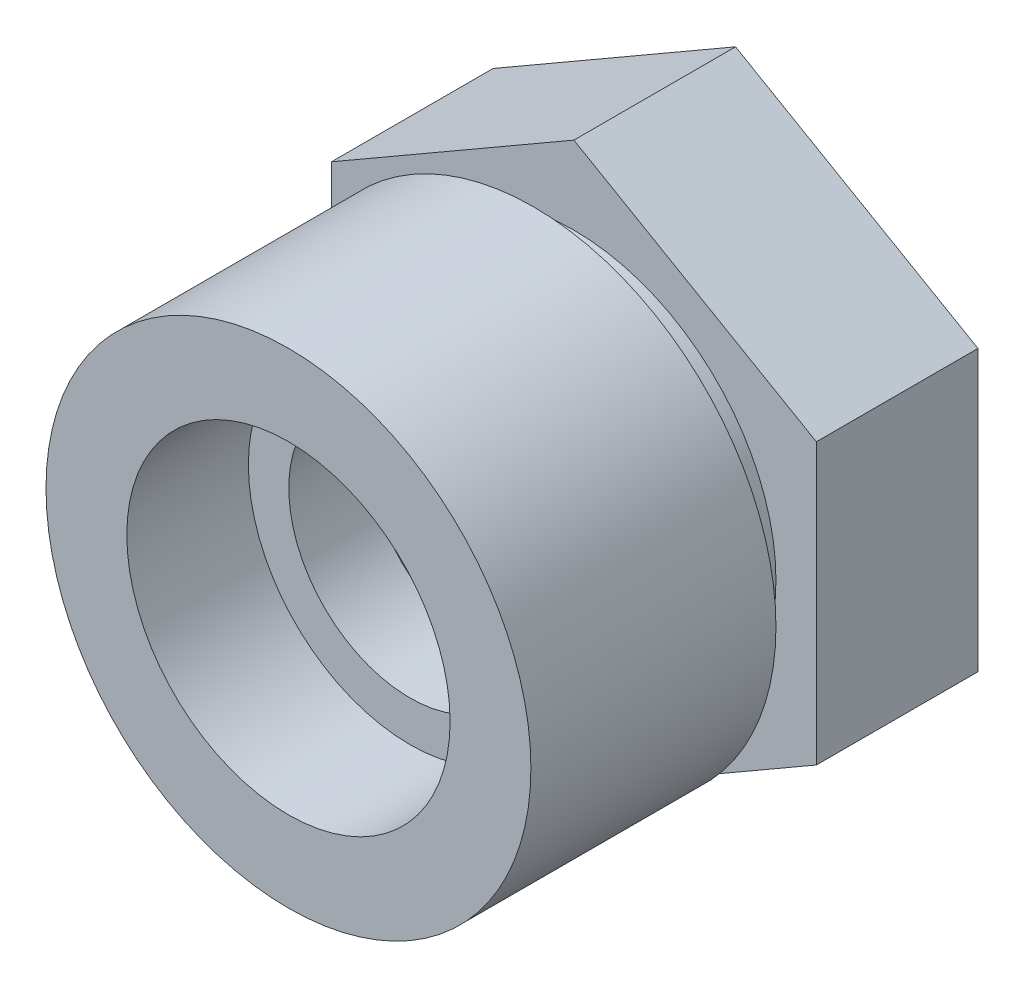
ISO-10303-21;
HEADER;
FILE_DESCRIPTION(('STEP AP214'),'2;1');
FILE_NAME('part.step','',(''),(''),'','','');
FILE_SCHEMA(('AUTOMOTIVE_DESIGN { 1 0 10303 214 1 1 1 1 }'));
ENDSEC;
DATA;
#1=APPLICATION_CONTEXT('core data for automotive mechanical design processes');
#2=APPLICATION_PROTOCOL_DEFINITION('international standard','automotive_design',2000,#1);
#3=PRODUCT_CONTEXT('',#1,'mechanical');
#4=PRODUCT('Part','Part','',(#3));
#5=PRODUCT_RELATED_PRODUCT_CATEGORY('part','',(#4));
#6=PRODUCT_DEFINITION_FORMATION('','',#4);
#7=PRODUCT_DEFINITION_CONTEXT('part definition',#1,'design');
#8=PRODUCT_DEFINITION('design','',#6,#7);
#9=PRODUCT_DEFINITION_SHAPE('','',#8);
#10=(LENGTH_UNIT() NAMED_UNIT(*) SI_UNIT(.MILLI.,.METRE.));
#11=(NAMED_UNIT(*) PLANE_ANGLE_UNIT() SI_UNIT($,.RADIAN.));
#12=(NAMED_UNIT(*) SI_UNIT($,.STERADIAN.) SOLID_ANGLE_UNIT());
#13=UNCERTAINTY_MEASURE_WITH_UNIT(LENGTH_MEASURE(1.E-05),#10,'distance_accuracy_value','');
#14=(GEOMETRIC_REPRESENTATION_CONTEXT(3) GLOBAL_UNCERTAINTY_ASSIGNED_CONTEXT((#13)) GLOBAL_UNIT_ASSIGNED_CONTEXT((#10,
#11,#12)) REPRESENTATION_CONTEXT('',''));
#15=CARTESIAN_POINT('',(0.,0.,0.));
#16=DIRECTION('',(0.,0.,1.));
#17=DIRECTION('',(1.,0.,0.));
#18=AXIS2_PLACEMENT_3D('',#15,#16,#17);
#19=CARTESIAN_POINT('',(0.,0.,-6.35));
#20=DIRECTION('',(0.,0.,-1.));
#21=DIRECTION('',(-1.,0.,0.));
#22=AXIS2_PLACEMENT_3D('',#19,#20,#21);
#23=CYLINDRICAL_SURFACE('',#22,2.01929999999999);
#24=CARTESIAN_POINT('',(0.,0.,1.5875));
#25=DIRECTION('',(0.,0.,1.));
#26=DIRECTION('',(1.,0.,0.));
#27=AXIS2_PLACEMENT_3D('',#24,#25,#26);
#28=CIRCLE('',#27,2.01929999999999);
#29=CARTESIAN_POINT('',(2.01929999999999,0.,1.5875));
#30=VERTEX_POINT('',#29);
#31=EDGE_CURVE('E68',#30,#30,#28,.T.);
#32=ORIENTED_EDGE('',*,*,#31,.F.);
#33=EDGE_LOOP('',(#32));
#34=FACE_BOUND('',#33,.T.);
#35=CARTESIAN_POINT('',(0.,0.,3.3909));
#36=DIRECTION('',(0.,0.,1.));
#37=DIRECTION('',(1.,0.,0.));
#38=AXIS2_PLACEMENT_3D('',#35,#36,#37);
#39=CIRCLE('',#38,2.01929999999999);
#40=CARTESIAN_POINT('',(2.01929999999999,0.,3.3909));
#41=VERTEX_POINT('',#40);
#42=EDGE_CURVE('E59',#41,#41,#39,.F.);
#43=ORIENTED_EDGE('',*,*,#42,.F.);
#44=EDGE_LOOP('',(#43));
#45=FACE_BOUND('',#44,.T.);
#46=ADVANCED_FACE('F55',(#34,#45),#23,.F.);
#47=CARTESIAN_POINT('',(0.,0.,11.2141));
#48=DIRECTION('',(0.,0.,-1.));
#49=DIRECTION('',(-1.,0.,0.));
#50=AXIS2_PLACEMENT_3D('',#47,#48,#49);
#51=CYLINDRICAL_SURFACE('',#50,9.525);
#52=CARTESIAN_POINT('',(0.,0.,11.2141));
#53=DIRECTION('',(0.,0.,1.));
#54=DIRECTION('',(1.,0.,0.));
#55=AXIS2_PLACEMENT_3D('',#52,#53,#54);
#56=CIRCLE('',#55,9.525);
#57=CARTESIAN_POINT('',(9.525,0.,11.2141));
#58=VERTEX_POINT('',#57);
#59=EDGE_CURVE('E13',#58,#58,#56,.T.);
#60=ORIENTED_EDGE('',*,*,#59,.F.);
#61=EDGE_LOOP('',(#60));
#62=FACE_BOUND('',#61,.T.);
#63=CARTESIAN_POINT('',(0.,0.,1.5875));
#64=DIRECTION('',(0.,0.,1.));
#65=DIRECTION('',(1.,0.,0.));
#66=AXIS2_PLACEMENT_3D('',#63,#64,#65);
#67=CIRCLE('',#66,9.525);
#68=CARTESIAN_POINT('',(9.525,0.,1.5875));
#69=VERTEX_POINT('',#68);
#70=EDGE_CURVE('E63',#69,#69,#67,.T.);
#71=ORIENTED_EDGE('',*,*,#70,.T.);
#72=EDGE_LOOP('',(#71));
#73=FACE_BOUND('',#72,.T.);
#74=ADVANCED_FACE('F57',(#62,#73),#51,.T.);
#75=CARTESIAN_POINT('',(0.,0.,11.2141));
#76=DIRECTION('',(0.,0.,1.));
#77=DIRECTION('',(1.,0.,0.));
#78=AXIS2_PLACEMENT_3D('',#75,#76,#77);
#79=PLANE('',#78);
#80=CARTESIAN_POINT('',(0.,0.,11.2141));
#81=DIRECTION('',(0.,0.,1.));
#82=DIRECTION('',(1.,0.,0.));
#83=AXIS2_PLACEMENT_3D('',#80,#81,#82);
#84=CIRCLE('',#83,6.35);
#85=CARTESIAN_POINT('',(6.35,0.,11.2141));
#86=VERTEX_POINT('',#85);
#87=EDGE_CURVE('E71',#86,#86,#84,.T.);
#88=ORIENTED_EDGE('',*,*,#87,.F.);
#89=EDGE_LOOP('',(#88));
#90=FACE_BOUND('',#89,.T.);
#91=ORIENTED_EDGE('',*,*,#59,.T.);
#92=EDGE_LOOP('',(#91));
#93=FACE_BOUND('',#92,.T.);
#94=ADVANCED_FACE('F100',(#90,#93),#79,.T.);
#95=CARTESIAN_POINT('',(0.,0.,1.5875));
#96=DIRECTION('',(0.,0.,1.));
#97=DIRECTION('',(1.,0.,0.));
#98=AXIS2_PLACEMENT_3D('',#95,#96,#97);
#99=PLANE('',#98);
#100=ORIENTED_EDGE('',*,*,#31,.T.);
#101=EDGE_LOOP('',(#100));
#102=FACE_BOUND('',#101,.T.);
#103=ORIENTED_EDGE('',*,*,#70,.F.);
#104=EDGE_LOOP('',(#103));
#105=FACE_BOUND('',#104,.T.);
#106=ADVANCED_FACE('F107',(#102,#105),#99,.F.);
#107=CARTESIAN_POINT('',(0.,0.,6.4389));
#108=DIRECTION('',(0.,0.,1.));
#109=DIRECTION('',(1.,0.,0.));
#110=AXIS2_PLACEMENT_3D('',#107,#108,#109);
#111=PLANE('',#110);
#112=CARTESIAN_POINT('',(0.,0.,6.4389));
#113=DIRECTION('',(0.,0.,1.));
#114=DIRECTION('',(1.,0.,0.));
#115=AXIS2_PLACEMENT_3D('',#112,#113,#114);
#116=CIRCLE('',#115,4.7625);
#117=CARTESIAN_POINT('',(4.7625,0.,6.4389));
#118=VERTEX_POINT('',#117);
#119=EDGE_CURVE('E82',#118,#118,#116,.T.);
#120=ORIENTED_EDGE('',*,*,#119,.F.);
#121=EDGE_LOOP('',(#120));
#122=FACE_BOUND('',#121,.T.);
#123=CARTESIAN_POINT('',(0.,0.,6.4389));
#124=DIRECTION('',(0.,0.,1.));
#125=DIRECTION('',(1.,0.,0.));
#126=AXIS2_PLACEMENT_3D('',#123,#124,#125);
#127=CIRCLE('',#126,6.35);
#128=CARTESIAN_POINT('',(6.35,0.,6.4389));
#129=VERTEX_POINT('',#128);
#130=EDGE_CURVE('E74',#129,#129,#127,.T.);
#131=ORIENTED_EDGE('',*,*,#130,.T.);
#132=EDGE_LOOP('',(#131));
#133=FACE_BOUND('',#132,.T.);
#134=ADVANCED_FACE('F110',(#122,#133),#111,.T.);
#135=CARTESIAN_POINT('',(0.,0.,6.4389));
#136=DIRECTION('',(0.,0.,1.));
#137=DIRECTION('',(1.,0.,0.));
#138=AXIS2_PLACEMENT_3D('',#135,#136,#137);
#139=CYLINDRICAL_SURFACE('',#138,6.35);
#140=ORIENTED_EDGE('',*,*,#130,.F.);
#141=EDGE_LOOP('',(#140));
#142=FACE_BOUND('',#141,.T.);
#143=ORIENTED_EDGE('',*,*,#87,.T.);
#144=EDGE_LOOP('',(#143));
#145=FACE_BOUND('',#144,.T.);
#146=ADVANCED_FACE('F104',(#142,#145),#139,.F.);
#147=CARTESIAN_POINT('',(0.,0.,3.3909));
#148=DIRECTION('',(0.,0.,1.));
#149=DIRECTION('',(1.,0.,0.));
#150=AXIS2_PLACEMENT_3D('',#147,#148,#149);
#151=PLANE('',#150);
#152=CARTESIAN_POINT('',(0.,0.,3.3909));
#153=DIRECTION('',(0.,0.,1.));
#154=DIRECTION('',(1.,0.,0.));
#155=AXIS2_PLACEMENT_3D('',#152,#153,#154);
#156=CIRCLE('',#155,4.7625);
#157=CARTESIAN_POINT('',(4.7625,0.,3.3909));
#158=VERTEX_POINT('',#157);
#159=EDGE_CURVE('E85',#158,#158,#156,.T.);
#160=ORIENTED_EDGE('',*,*,#159,.T.);
#161=EDGE_LOOP('',(#160));
#162=FACE_BOUND('',#161,.T.);
#163=ORIENTED_EDGE('',*,*,#42,.T.);
#164=EDGE_LOOP('',(#163));
#165=FACE_BOUND('',#164,.T.);
#166=ADVANCED_FACE('F92',(#162,#165),#151,.T.);
#167=CARTESIAN_POINT('',(0.,0.,3.3909));
#168=DIRECTION('',(0.,0.,1.));
#169=DIRECTION('',(1.,0.,0.));
#170=AXIS2_PLACEMENT_3D('',#167,#168,#169);
#171=CYLINDRICAL_SURFACE('',#170,4.7625);
#172=CARTESIAN_POINT('',(4.7625,0.,3.3909));
#173=CARTESIAN_POINT('',(4.7625,0.,3.42265));
#174=CARTESIAN_POINT('',(4.7625,0.,3.4544));
#175=CARTESIAN_POINT('',(4.7625,0.,3.5179));
#176=CARTESIAN_POINT('',(4.7625,0.,3.54965));
#177=CARTESIAN_POINT('',(4.7625,0.,3.61315));
#178=CARTESIAN_POINT('',(4.7625,0.,3.6449));
#179=CARTESIAN_POINT('',(4.7625,0.,3.7084));
#180=CARTESIAN_POINT('',(4.7625,0.,3.74015));
#181=CARTESIAN_POINT('',(4.7625,0.,3.80365));
#182=CARTESIAN_POINT('',(4.7625,0.,3.8354));
#183=CARTESIAN_POINT('',(4.7625,0.,3.8989));
#184=CARTESIAN_POINT('',(4.7625,0.,3.93065));
#185=CARTESIAN_POINT('',(4.7625,0.,3.99415));
#186=CARTESIAN_POINT('',(4.7625,0.,4.0259));
#187=CARTESIAN_POINT('',(4.7625,0.,4.0894));
#188=CARTESIAN_POINT('',(4.7625,0.,4.12115));
#189=CARTESIAN_POINT('',(4.7625,0.,4.18465));
#190=CARTESIAN_POINT('',(4.7625,0.,4.2164));
#191=CARTESIAN_POINT('',(4.7625,0.,4.2799));
#192=CARTESIAN_POINT('',(4.7625,0.,4.31165));
#193=CARTESIAN_POINT('',(4.7625,0.,4.37515));
#194=CARTESIAN_POINT('',(4.7625,0.,4.4069));
#195=CARTESIAN_POINT('',(4.7625,0.,4.4704));
#196=CARTESIAN_POINT('',(4.7625,0.,4.50215));
#197=CARTESIAN_POINT('',(4.7625,0.,4.56565));
#198=CARTESIAN_POINT('',(4.7625,0.,4.5974));
#199=CARTESIAN_POINT('',(4.7625,0.,4.6609));
#200=CARTESIAN_POINT('',(4.7625,0.,4.69265));
#201=CARTESIAN_POINT('',(4.7625,0.,4.75615));
#202=CARTESIAN_POINT('',(4.7625,0.,4.7879));
#203=CARTESIAN_POINT('',(4.7625,0.,4.8514));
#204=CARTESIAN_POINT('',(4.7625,0.,4.88315));
#205=CARTESIAN_POINT('',(4.7625,0.,4.94665));
#206=CARTESIAN_POINT('',(4.7625,0.,4.9784));
#207=CARTESIAN_POINT('',(4.7625,0.,5.0419));
#208=CARTESIAN_POINT('',(4.7625,0.,5.07365));
#209=CARTESIAN_POINT('',(4.7625,0.,5.13715));
#210=CARTESIAN_POINT('',(4.7625,0.,5.1689));
#211=CARTESIAN_POINT('',(4.7625,0.,5.2324));
#212=CARTESIAN_POINT('',(4.7625,0.,5.26415));
#213=CARTESIAN_POINT('',(4.7625,0.,5.32765));
#214=CARTESIAN_POINT('',(4.7625,0.,5.3594));
#215=CARTESIAN_POINT('',(4.7625,0.,5.4229));
#216=CARTESIAN_POINT('',(4.7625,0.,5.45465));
#217=CARTESIAN_POINT('',(4.7625,0.,5.51815));
#218=CARTESIAN_POINT('',(4.7625,0.,5.5499));
#219=CARTESIAN_POINT('',(4.7625,0.,5.6134));
#220=CARTESIAN_POINT('',(4.7625,0.,5.64515));
#221=CARTESIAN_POINT('',(4.7625,0.,5.70865));
#222=CARTESIAN_POINT('',(4.7625,0.,5.7404));
#223=CARTESIAN_POINT('',(4.7625,0.,5.8039));
#224=CARTESIAN_POINT('',(4.7625,0.,5.83565));
#225=CARTESIAN_POINT('',(4.7625,0.,5.89915));
#226=CARTESIAN_POINT('',(4.7625,0.,5.9309));
#227=CARTESIAN_POINT('',(4.7625,0.,5.9944));
#228=CARTESIAN_POINT('',(4.7625,0.,6.02615));
#229=CARTESIAN_POINT('',(4.7625,0.,6.08965));
#230=CARTESIAN_POINT('',(4.7625,0.,6.1214));
#231=CARTESIAN_POINT('',(4.7625,0.,6.1849));
#232=CARTESIAN_POINT('',(4.7625,0.,6.21665));
#233=CARTESIAN_POINT('',(4.7625,0.,6.28015));
#234=CARTESIAN_POINT('',(4.7625,0.,6.3119));
#235=CARTESIAN_POINT('',(4.7625,0.,6.3754));
#236=CARTESIAN_POINT('',(4.7625,0.,6.40715));
#237=CARTESIAN_POINT('',(4.7625,0.,6.4389));
#238=B_SPLINE_CURVE_WITH_KNOTS('',3,(#172,#173,#174,#175,#176,#177,#178,#179,#180,#181,#182,
#183,#184,#185,#186,#187,#188,#189,#190,#191,#192,#193,#194,#195,#196,#197,#198,#199,#200,#201,
#202,#203,#204,#205,#206,#207,#208,#209,#210,#211,#212,#213,#214,#215,#216,#217,#218,#219,#220,
#221,#222,#223,#224,#225,#226,#227,#228,#229,#230,#231,#232,#233,#234,#235,#236,#237),
.UNSPECIFIED.,.F.,.F.,(4,2,2,2,2,2,2,2,2,2,2,2,2,2,2,2,2,2,2,2,2,2,2,2,2,2,2,2,2,2,2,2,4),(0.,
0.0952500000000003,0.1905,0.28575,0.381,0.47625,0.5715,0.66675,0.762000000000001,0.85725,0.9525,
1.04775,1.143,1.23825,1.3335,1.42875,1.524,1.61925,1.7145,1.80975,1.905,2.00025,2.0955,2.19075,
2.286,2.38125,2.4765,2.57175,2.667,2.76225,2.8575,2.95275,3.048),.UNSPECIFIED.);
#239=EDGE_CURVE('BSEAM124',#158,#118,#238,.T.);
#240=ORIENTED_EDGE('',*,*,#159,.F.);
#241=ORIENTED_EDGE('',*,*,#119,.T.);
#242=ORIENTED_EDGE('',*,*,#239,.T.);
#243=ORIENTED_EDGE('',*,*,#239,.F.);
#244=EDGE_LOOP('',(#240,#242,#241,#243));
#245=FACE_BOUND('',#244,.T.);
#246=ADVANCED_FACE('F124',(#245),#171,.F.);
#247=CLOSED_SHELL('',(#46,#74,#94,#106,#134,#146,#166,#246));
#248=MANIFOLD_SOLID_BREP('B2',#247);
#249=CARTESIAN_POINT('',(0.,0.,1.5875));
#250=DIRECTION('',(0.,0.,-1.));
#251=DIRECTION('',(-1.,0.,0.));
#252=AXIS2_PLACEMENT_3D('',#249,#250,#251);
#253=CYLINDRICAL_SURFACE('',#252,7.9375);
#254=CARTESIAN_POINT('',(0.,0.,1.5875));
#255=DIRECTION('',(0.,0.,1.));
#256=DIRECTION('',(1.,0.,0.));
#257=AXIS2_PLACEMENT_3D('',#254,#255,#256);
#258=CIRCLE('',#257,7.9375);
#259=CARTESIAN_POINT('',(7.9375,0.,1.5875));
#260=VERTEX_POINT('',#259);
#261=EDGE_CURVE('E54',#260,#260,#258,.T.);
#262=ORIENTED_EDGE('',*,*,#261,.F.);
#263=EDGE_LOOP('',(#262));
#264=FACE_BOUND('',#263,.T.);
#265=CARTESIAN_POINT('',(0.,0.,0.));
#266=DIRECTION('',(0.,0.,1.));
#267=DIRECTION('',(1.,0.,0.));
#268=AXIS2_PLACEMENT_3D('',#265,#266,#267);
#269=CIRCLE('',#268,7.9375);
#270=CARTESIAN_POINT('',(7.9375,0.,0.));
#271=VERTEX_POINT('',#270);
#272=EDGE_CURVE('E204',#271,#271,#269,.T.);
#273=ORIENTED_EDGE('',*,*,#272,.T.);
#274=EDGE_LOOP('',(#273));
#275=FACE_BOUND('',#274,.T.);
#276=ADVANCED_FACE('F197',(#264,#275),#253,.T.);
#277=CARTESIAN_POINT('',(0.,0.,1.5875));
#278=DIRECTION('',(0.,0.,1.));
#279=DIRECTION('',(1.,0.,0.));
#280=AXIS2_PLACEMENT_3D('',#277,#278,#279);
#281=PLANE('',#280);
#282=CARTESIAN_POINT('',(0.,0.,1.5875));
#283=DIRECTION('',(0.,0.,1.));
#284=DIRECTION('',(1.,0.,0.));
#285=AXIS2_PLACEMENT_3D('',#282,#283,#284);
#286=CIRCLE('',#285,2.01929999999999);
#287=CARTESIAN_POINT('',(2.01929999999999,0.,1.5875));
#288=VERTEX_POINT('',#287);
#289=EDGE_CURVE('E209',#288,#288,#286,.T.);
#290=ORIENTED_EDGE('',*,*,#289,.F.);
#291=EDGE_LOOP('',(#290));
#292=FACE_BOUND('',#291,.T.);
#293=ORIENTED_EDGE('',*,*,#261,.T.);
#294=EDGE_LOOP('',(#293));
#295=FACE_BOUND('',#294,.T.);
#296=ADVANCED_FACE('F226',(#292,#295),#281,.T.);
#297=CARTESIAN_POINT('',(0.,0.,0.));
#298=DIRECTION('',(0.,0.,1.));
#299=DIRECTION('',(1.,0.,0.));
#300=AXIS2_PLACEMENT_3D('',#297,#298,#299);
#301=PLANE('',#300);
#302=CARTESIAN_POINT('',(0.,0.,0.));
#303=DIRECTION('',(0.,0.,1.));
#304=DIRECTION('',(1.,0.,0.));
#305=AXIS2_PLACEMENT_3D('',#302,#303,#304);
#306=CIRCLE('',#305,2.01929999999999);
#307=CARTESIAN_POINT('',(2.01929999999999,0.,0.));
#308=VERTEX_POINT('',#307);
#309=EDGE_CURVE('E200',#308,#308,#306,.T.);
#310=ORIENTED_EDGE('',*,*,#309,.T.);
#311=EDGE_LOOP('',(#310));
#312=FACE_BOUND('',#311,.T.);
#313=ORIENTED_EDGE('',*,*,#272,.F.);
#314=EDGE_LOOP('',(#313));
#315=FACE_BOUND('',#314,.T.);
#316=ADVANCED_FACE('F217',(#312,#315),#301,.F.);
#317=CARTESIAN_POINT('',(0.,0.,-6.35));
#318=DIRECTION('',(0.,0.,-1.));
#319=DIRECTION('',(-1.,0.,0.));
#320=AXIS2_PLACEMENT_3D('',#317,#318,#319);
#321=CYLINDRICAL_SURFACE('',#320,2.01929999999999);
#322=ORIENTED_EDGE('',*,*,#289,.T.);
#323=EDGE_LOOP('',(#322));
#324=FACE_BOUND('',#323,.T.);
#325=ORIENTED_EDGE('',*,*,#309,.F.);
#326=EDGE_LOOP('',(#325));
#327=FACE_BOUND('',#326,.T.);
#328=ADVANCED_FACE('F220',(#324,#327),#321,.F.);
#329=CLOSED_SHELL('',(#276,#296,#316,#328));
#330=MANIFOLD_SOLID_BREP('B8',#329);
#331=CARTESIAN_POINT('',(-9.52499999999994,-5.4992613140313,-6.35));
#332=DIRECTION('',(-0.499999999999995,-0.866025403784441,0.));
#333=DIRECTION('',(0.866025403784442,-0.499999999999995,0.));
#334=AXIS2_PLACEMENT_3D('',#331,#332,#333);
#335=PLANE('',#334);
#336=DIRECTION('',(0.866025403784441,-0.499999999999995,0.));
#337=VECTOR('',#336,1.);
#338=CARTESIAN_POINT('',(-9.52499999999994,-5.4992613140313,0.));
#339=LINE('',#338,#337);
#340=CARTESIAN_POINT('',(-9.52499999999994,-5.4992613140313,0.));
#341=VERTEX_POINT('',#340);
#342=CARTESIAN_POINT('',(0.,-10.9985226280624,0.));
#343=VERTEX_POINT('',#342);
#344=EDGE_CURVE('E353',#341,#343,#339,.T.);
#345=ORIENTED_EDGE('',*,*,#344,.F.);
#346=DIRECTION('',(0.,0.,1.));
#347=VECTOR('',#346,1.);
#348=CARTESIAN_POINT('',(-9.52499999999994,-5.4992613140313,-6.35));
#349=LINE('',#348,#347);
#350=CARTESIAN_POINT('',(-9.52499999999994,-5.4992613140313,-6.35));
#351=VERTEX_POINT('',#350);
#352=EDGE_CURVE('E195',#351,#341,#349,.T.);
#353=ORIENTED_EDGE('',*,*,#352,.F.);
#354=DIRECTION('',(0.866025403784441,-0.499999999999995,0.));
#355=VECTOR('',#354,1.);
#356=CARTESIAN_POINT('',(-9.52499999999994,-5.4992613140313,-6.35));
#357=LINE('',#356,#355);
#358=CARTESIAN_POINT('',(0.,-10.9985226280624,-6.35));
#359=VERTEX_POINT('',#358);
#360=EDGE_CURVE('E368',#351,#359,#357,.T.);
#361=ORIENTED_EDGE('',*,*,#360,.T.);
#362=DIRECTION('',(0.,0.,1.));
#363=VECTOR('',#362,1.);
#364=CARTESIAN_POINT('',(0.,-10.9985226280624,-6.35));
#365=LINE('',#364,#363);
#366=EDGE_CURVE('E271',#359,#343,#365,.T.);
#367=ORIENTED_EDGE('',*,*,#366,.T.);
#368=EDGE_LOOP('',(#345,#353,#361,#367));
#369=FACE_BOUND('',#368,.T.);
#370=ADVANCED_FACE('F268',(#369),#335,.T.);
#371=CARTESIAN_POINT('',(-9.52500000000006,5.4992613140311,-6.35));
#372=DIRECTION('',(-1.,0.,0.));
#373=DIRECTION('',(0.,-1.,0.));
#374=AXIS2_PLACEMENT_3D('',#371,#372,#373);
#375=PLANE('',#374);
#376=DIRECTION('',(0.,-1.,0.));
#377=VECTOR('',#376,1.);
#378=CARTESIAN_POINT('',(-9.52500000000006,5.4992613140311,0.));
#379=LINE('',#378,#377);
#380=CARTESIAN_POINT('',(-9.52500000000006,5.4992613140311,0.));
#381=VERTEX_POINT('',#380);
#382=EDGE_CURVE('E366',#381,#341,#379,.T.);
#383=ORIENTED_EDGE('',*,*,#382,.F.);
#384=DIRECTION('',(0.,0.,1.));
#385=VECTOR('',#384,1.);
#386=CARTESIAN_POINT('',(-9.52500000000006,5.4992613140311,-6.35));
#387=LINE('',#386,#385);
#388=CARTESIAN_POINT('',(-9.52500000000006,5.4992613140311,-6.35));
#389=VERTEX_POINT('',#388);
#390=EDGE_CURVE('E277',#389,#381,#387,.T.);
#391=ORIENTED_EDGE('',*,*,#390,.F.);
#392=DIRECTION('',(0.,-1.,0.));
#393=VECTOR('',#392,1.);
#394=CARTESIAN_POINT('',(-9.52500000000006,5.4992613140311,-6.35));
#395=LINE('',#394,#393);
#396=EDGE_CURVE('E343',#389,#351,#395,.T.);
#397=ORIENTED_EDGE('',*,*,#396,.T.);
#398=ORIENTED_EDGE('',*,*,#352,.T.);
#399=EDGE_LOOP('',(#383,#391,#397,#398));
#400=FACE_BOUND('',#399,.T.);
#401=ADVANCED_FACE('F376',(#400),#375,.T.);
#402=CARTESIAN_POINT('',(0.,10.9985226280624,-6.35));
#403=DIRECTION('',(-0.500000000000007,0.866025403784435,0.));
#404=DIRECTION('',(-0.866025403784435,-0.500000000000007,0.));
#405=AXIS2_PLACEMENT_3D('',#402,#403,#404);
#406=PLANE('',#405);
#407=DIRECTION('',(-0.866025403784435,-0.500000000000007,0.));
#408=VECTOR('',#407,1.);
#409=CARTESIAN_POINT('',(0.,10.9985226280624,0.));
#410=LINE('',#409,#408);
#411=CARTESIAN_POINT('',(0.,10.9985226280624,0.));
#412=VERTEX_POINT('',#411);
#413=EDGE_CURVE('E330',#412,#381,#410,.T.);
#414=ORIENTED_EDGE('',*,*,#413,.F.);
#415=DIRECTION('',(0.,0.,1.));
#416=VECTOR('',#415,1.);
#417=CARTESIAN_POINT('',(0.,10.9985226280624,-6.35));
#418=LINE('',#417,#416);
#419=CARTESIAN_POINT('',(0.,10.9985226280624,-6.35));
#420=VERTEX_POINT('',#419);
#421=EDGE_CURVE('E325',#420,#412,#418,.T.);
#422=ORIENTED_EDGE('',*,*,#421,.F.);
#423=DIRECTION('',(-0.866025403784435,-0.500000000000007,0.));
#424=VECTOR('',#423,1.);
#425=CARTESIAN_POINT('',(0.,10.9985226280624,-6.35));
#426=LINE('',#425,#424);
#427=EDGE_CURVE('E328',#420,#389,#426,.T.);
#428=ORIENTED_EDGE('',*,*,#427,.T.);
#429=ORIENTED_EDGE('',*,*,#390,.T.);
#430=EDGE_LOOP('',(#414,#422,#428,#429));
#431=FACE_BOUND('',#430,.T.);
#432=ADVANCED_FACE('F327',(#431),#406,.T.);
#433=CARTESIAN_POINT('',(9.52499999999998,5.49926131403123,-6.35));
#434=DIRECTION('',(0.499999999999995,0.866025403784441,0.));
#435=DIRECTION('',(-0.866025403784441,0.499999999999995,0.));
#436=AXIS2_PLACEMENT_3D('',#433,#434,#435);
#437=PLANE('',#436);
#438=DIRECTION('',(-0.866025403784441,0.499999999999995,0.));
#439=VECTOR('',#438,1.);
#440=CARTESIAN_POINT('',(9.52499999999998,5.49926131403123,0.));
#441=LINE('',#440,#439);
#442=CARTESIAN_POINT('',(9.52499999999998,5.49926131403123,0.));
#443=VERTEX_POINT('',#442);
#444=EDGE_CURVE('E363',#443,#412,#441,.T.);
#445=ORIENTED_EDGE('',*,*,#444,.F.);
#446=DIRECTION('',(0.,0.,1.));
#447=VECTOR('',#446,1.);
#448=CARTESIAN_POINT('',(9.52499999999998,5.49926131403123,-6.35));
#449=LINE('',#448,#447);
#450=CARTESIAN_POINT('',(9.52499999999998,5.49926131403123,-6.35));
#451=VERTEX_POINT('',#450);
#452=EDGE_CURVE('E335',#451,#443,#449,.T.);
#453=ORIENTED_EDGE('',*,*,#452,.F.);
#454=DIRECTION('',(-0.866025403784441,0.499999999999995,0.));
#455=VECTOR('',#454,1.);
#456=CARTESIAN_POINT('',(9.52499999999998,5.49926131403123,-6.35));
#457=LINE('',#456,#455);
#458=EDGE_CURVE('E341',#451,#420,#457,.T.);
#459=ORIENTED_EDGE('',*,*,#458,.T.);
#460=ORIENTED_EDGE('',*,*,#421,.T.);
#461=EDGE_LOOP('',(#445,#453,#459,#460));
#462=FACE_BOUND('',#461,.T.);
#463=ADVANCED_FACE('F345',(#462),#437,.T.);
#464=CARTESIAN_POINT('',(9.52500000000002,-5.49926131403117,-6.35));
#465=DIRECTION('',(1.,0.,0.));
#466=DIRECTION('',(0.,1.,0.));
#467=AXIS2_PLACEMENT_3D('',#464,#465,#466);
#468=PLANE('',#467);
#469=DIRECTION('',(0.,1.,0.));
#470=VECTOR('',#469,1.);
#471=CARTESIAN_POINT('',(9.52500000000002,-5.49926131403117,0.));
#472=LINE('',#471,#470);
#473=CARTESIAN_POINT('',(9.52500000000002,-5.49926131403117,0.));
#474=VERTEX_POINT('',#473);
#475=EDGE_CURVE('E360',#474,#443,#472,.T.);
#476=ORIENTED_EDGE('',*,*,#475,.F.);
#477=DIRECTION('',(0.,0.,1.));
#478=VECTOR('',#477,1.);
#479=CARTESIAN_POINT('',(9.52500000000002,-5.49926131403117,-6.35));
#480=LINE('',#479,#478);
#481=CARTESIAN_POINT('',(9.52500000000002,-5.49926131403117,-6.35));
#482=VERTEX_POINT('',#481);
#483=EDGE_CURVE('E371',#482,#474,#480,.T.);
#484=ORIENTED_EDGE('',*,*,#483,.F.);
#485=DIRECTION('',(0.,1.,0.));
#486=VECTOR('',#485,1.);
#487=CARTESIAN_POINT('',(9.52500000000002,-5.49926131403117,-6.35));
#488=LINE('',#487,#486);
#489=EDGE_CURVE('E346',#482,#451,#488,.T.);
#490=ORIENTED_EDGE('',*,*,#489,.T.);
#491=ORIENTED_EDGE('',*,*,#452,.T.);
#492=EDGE_LOOP('',(#476,#484,#490,#491));
#493=FACE_BOUND('',#492,.T.);
#494=ADVANCED_FACE('F389',(#493),#468,.T.);
#495=CARTESIAN_POINT('',(0.,-10.9985226280624,-6.35));
#496=DIRECTION('',(0.500000000000001,-0.866025403784438,0.));
#497=DIRECTION('',(0.866025403784438,0.500000000000001,0.));
#498=AXIS2_PLACEMENT_3D('',#495,#496,#497);
#499=PLANE('',#498);
#500=DIRECTION('',(0.866025403784438,0.500000000000001,0.));
#501=VECTOR('',#500,1.);
#502=CARTESIAN_POINT('',(0.,-10.9985226280624,0.));
#503=LINE('',#502,#501);
#504=EDGE_CURVE('E356',#343,#474,#503,.T.);
#505=ORIENTED_EDGE('',*,*,#504,.F.);
#506=ORIENTED_EDGE('',*,*,#366,.F.);
#507=DIRECTION('',(0.866025403784438,0.500000000000001,0.));
#508=VECTOR('',#507,1.);
#509=CARTESIAN_POINT('',(0.,-10.9985226280624,-6.35));
#510=LINE('',#509,#508);
#511=EDGE_CURVE('E348',#359,#482,#510,.T.);
#512=ORIENTED_EDGE('',*,*,#511,.T.);
#513=ORIENTED_EDGE('',*,*,#483,.T.);
#514=EDGE_LOOP('',(#505,#506,#512,#513));
#515=FACE_BOUND('',#514,.T.);
#516=ADVANCED_FACE('F373',(#515),#499,.T.);
#517=CARTESIAN_POINT('',(0.,0.,-6.35));
#518=DIRECTION('',(0.,0.,1.));
#519=DIRECTION('',(1.,0.,0.));
#520=AXIS2_PLACEMENT_3D('',#517,#518,#519);
#521=PLANE('',#520);
#522=CARTESIAN_POINT('',(0.,0.,-6.35));
#523=DIRECTION('',(0.,0.,-1.));
#524=DIRECTION('',(-1.,0.,0.));
#525=AXIS2_PLACEMENT_3D('',#522,#523,#524);
#526=CIRCLE('',#525,2.01929999999999);
#527=CARTESIAN_POINT('',(-2.01929999999999,0.,-6.35));
#528=VERTEX_POINT('',#527);
#529=EDGE_CURVE('E412',#528,#528,#526,.T.);
#530=ORIENTED_EDGE('',*,*,#529,.F.);
#531=EDGE_LOOP('',(#530));
#532=FACE_BOUND('',#531,.T.);
#533=ORIENTED_EDGE('',*,*,#360,.F.);
#534=ORIENTED_EDGE('',*,*,#396,.F.);
#535=ORIENTED_EDGE('',*,*,#427,.F.);
#536=ORIENTED_EDGE('',*,*,#458,.F.);
#537=ORIENTED_EDGE('',*,*,#489,.F.);
#538=ORIENTED_EDGE('',*,*,#511,.F.);
#539=EDGE_LOOP('',(#533,#534,#535,#536,#537,#538));
#540=FACE_BOUND('',#539,.T.);
#541=ADVANCED_FACE('F339',(#532,#540),#521,.F.);
#542=CARTESIAN_POINT('',(0.,0.,0.));
#543=DIRECTION('',(0.,0.,1.));
#544=DIRECTION('',(1.,0.,0.));
#545=AXIS2_PLACEMENT_3D('',#542,#543,#544);
#546=PLANE('',#545);
#547=CARTESIAN_POINT('',(0.,0.,0.));
#548=DIRECTION('',(0.,0.,1.));
#549=DIRECTION('',(1.,0.,0.));
#550=AXIS2_PLACEMENT_3D('',#547,#548,#549);
#551=CIRCLE('',#550,2.01929999999999);
#552=CARTESIAN_POINT('',(2.01929999999999,0.,0.));
#553=VERTEX_POINT('',#552);
#554=EDGE_CURVE('E357',#553,#553,#551,.T.);
#555=ORIENTED_EDGE('',*,*,#554,.F.);
#556=EDGE_LOOP('',(#555));
#557=FACE_BOUND('',#556,.T.);
#558=ORIENTED_EDGE('',*,*,#344,.T.);
#559=ORIENTED_EDGE('',*,*,#504,.T.);
#560=ORIENTED_EDGE('',*,*,#475,.T.);
#561=ORIENTED_EDGE('',*,*,#444,.T.);
#562=ORIENTED_EDGE('',*,*,#413,.T.);
#563=ORIENTED_EDGE('',*,*,#382,.T.);
#564=EDGE_LOOP('',(#558,#559,#560,#561,#562,#563));
#565=FACE_BOUND('',#564,.T.);
#566=ADVANCED_FACE('F375',(#557,#565),#546,.T.);
#567=CARTESIAN_POINT('',(0.,0.,-6.35));
#568=DIRECTION('',(0.,0.,-1.));
#569=DIRECTION('',(-1.,0.,0.));
#570=AXIS2_PLACEMENT_3D('',#567,#568,#569);
#571=CYLINDRICAL_SURFACE('',#570,2.01929999999999);
#572=ORIENTED_EDGE('',*,*,#554,.T.);
#573=EDGE_LOOP('',(#572));
#574=FACE_BOUND('',#573,.T.);
#575=ORIENTED_EDGE('',*,*,#529,.T.);
#576=EDGE_LOOP('',(#575));
#577=FACE_BOUND('',#576,.T.);
#578=ADVANCED_FACE('F400',(#574,#577),#571,.F.);
#579=CLOSED_SHELL('',(#370,#401,#432,#463,#494,#516,#541,#566,#578));
#580=MANIFOLD_SOLID_BREP('B49',#579);
#581=ADVANCED_BREP_SHAPE_REPRESENTATION('',(#18,#248,#330,#580),#14);
#582=SHAPE_DEFINITION_REPRESENTATION(#9,#581);
ENDSEC;
END-ISO-10303-21;
